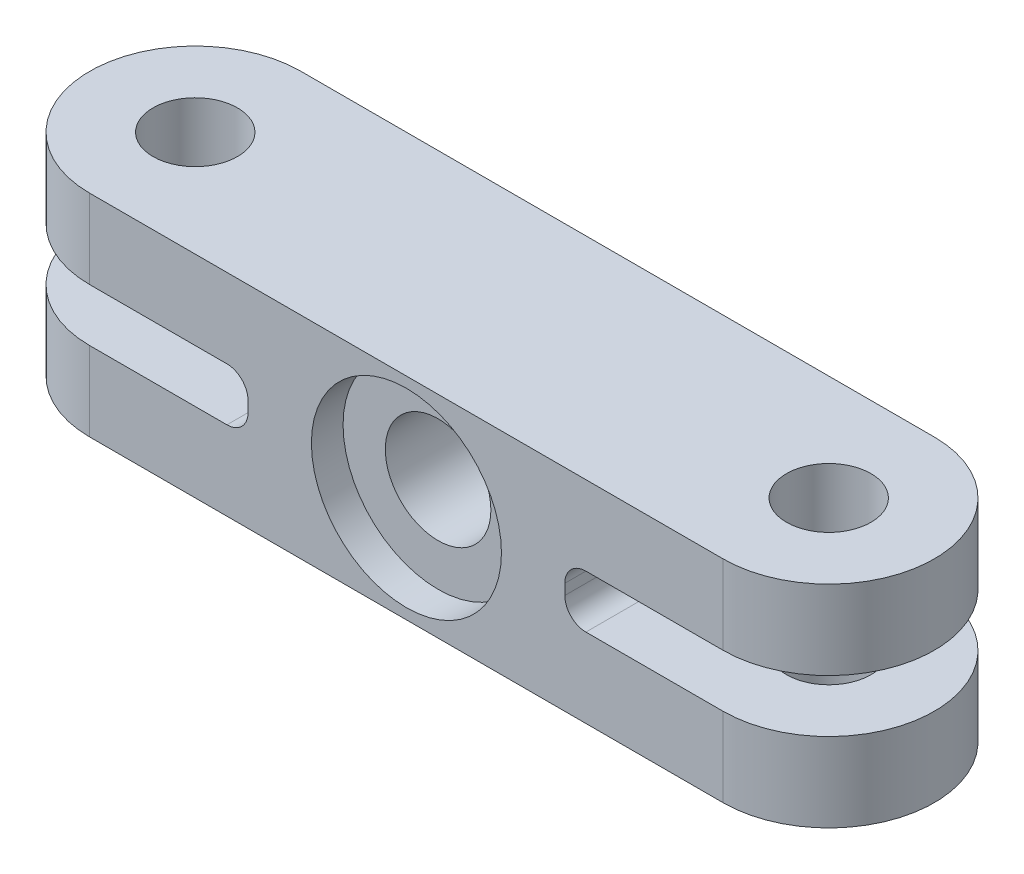
ISO-10303-21;
HEADER;
FILE_DESCRIPTION(('STEP AP214'),'2;1');
FILE_NAME('part.step','',(''),(''),'','','');
FILE_SCHEMA(('AUTOMOTIVE_DESIGN { 1 0 10303 214 1 1 1 1 }'));
ENDSEC;
DATA;
#1=APPLICATION_CONTEXT('core data for automotive mechanical design processes');
#2=APPLICATION_PROTOCOL_DEFINITION('international standard','automotive_design',2000,#1);
#3=PRODUCT_CONTEXT('',#1,'mechanical');
#4=PRODUCT('Part','Part','',(#3));
#5=PRODUCT_RELATED_PRODUCT_CATEGORY('part','',(#4));
#6=PRODUCT_DEFINITION_FORMATION('','',#4);
#7=PRODUCT_DEFINITION_CONTEXT('part definition',#1,'design');
#8=PRODUCT_DEFINITION('design','',#6,#7);
#9=PRODUCT_DEFINITION_SHAPE('','',#8);
#10=(LENGTH_UNIT() NAMED_UNIT(*) SI_UNIT(.MILLI.,.METRE.));
#11=(NAMED_UNIT(*) PLANE_ANGLE_UNIT() SI_UNIT($,.RADIAN.));
#12=(NAMED_UNIT(*) SI_UNIT($,.STERADIAN.) SOLID_ANGLE_UNIT());
#13=UNCERTAINTY_MEASURE_WITH_UNIT(LENGTH_MEASURE(1.E-05),#10,'distance_accuracy_value','');
#14=(GEOMETRIC_REPRESENTATION_CONTEXT(3) GLOBAL_UNCERTAINTY_ASSIGNED_CONTEXT((#13)) GLOBAL_UNIT_ASSIGNED_CONTEXT((#10,
#11,#12)) REPRESENTATION_CONTEXT('',''));
#15=CARTESIAN_POINT('',(0.,0.,0.));
#16=DIRECTION('',(0.,0.,1.));
#17=DIRECTION('',(1.,0.,0.));
#18=AXIS2_PLACEMENT_3D('',#15,#16,#17);
#19=CARTESIAN_POINT('',(0.,10.,-10.));
#20=DIRECTION('',(0.,0.,1.));
#21=DIRECTION('',(1.,0.,0.));
#22=AXIS2_PLACEMENT_3D('',#19,#20,#21);
#23=CYLINDRICAL_SURFACE('',#22,5.);
#24=CARTESIAN_POINT('',(0.,10.,-10.));
#25=DIRECTION('',(0.,0.,1.));
#26=DIRECTION('',(1.,0.,0.));
#27=AXIS2_PLACEMENT_3D('',#24,#25,#26);
#28=CIRCLE('',#27,5.);
#29=CARTESIAN_POINT('',(5.,10.,-10.));
#30=VERTEX_POINT('',#29);
#31=EDGE_CURVE('E215',#30,#30,#28,.T.);
#32=ORIENTED_EDGE('',*,*,#31,.F.);
#33=EDGE_LOOP('',(#32));
#34=FACE_BOUND('',#33,.T.);
#35=CARTESIAN_POINT('',(0.,10.,7.));
#36=DIRECTION('',(0.,0.,1.));
#37=DIRECTION('',(1.,0.,0.));
#38=AXIS2_PLACEMENT_3D('',#35,#36,#37);
#39=CIRCLE('',#38,5.);
#40=CARTESIAN_POINT('',(5.,10.,7.));
#41=VERTEX_POINT('',#40);
#42=EDGE_CURVE('E36',#41,#41,#39,.F.);
#43=ORIENTED_EDGE('',*,*,#42,.F.);
#44=EDGE_LOOP('',(#43));
#45=FACE_BOUND('',#44,.T.);
#46=ADVANCED_FACE('F32',(#34,#45),#23,.F.);
#47=CARTESIAN_POINT('',(30.,20.,0.));
#48=DIRECTION('',(0.,-1.,0.));
#49=DIRECTION('',(0.,0.,-1.));
#50=AXIS2_PLACEMENT_3D('',#47,#48,#49);
#51=CYLINDRICAL_SURFACE('',#50,10.);
#52=DIRECTION('',(0.,-1.,0.));
#53=VECTOR('',#52,1.);
#54=CARTESIAN_POINT('',(30.,20.,10.));
#55=LINE('',#54,#53);
#56=CARTESIAN_POINT('',(30.,20.,10.));
#57=VERTEX_POINT('',#56);
#58=CARTESIAN_POINT('',(30.,12.5,10.));
#59=VERTEX_POINT('',#58);
#60=EDGE_CURVE('E276',#57,#59,#55,.T.);
#61=ORIENTED_EDGE('',*,*,#60,.T.);
#62=CARTESIAN_POINT('',(30.,12.5,0.));
#63=DIRECTION('',(0.,1.,0.));
#64=DIRECTION('',(0.,0.,1.));
#65=AXIS2_PLACEMENT_3D('',#62,#63,#64);
#66=CIRCLE('',#65,10.);
#67=CARTESIAN_POINT('',(30.,12.5,-10.));
#68=VERTEX_POINT('',#67);
#69=EDGE_CURVE('E57',#59,#68,#66,.T.);
#70=ORIENTED_EDGE('',*,*,#69,.T.);
#71=DIRECTION('',(0.,-1.,0.));
#72=VECTOR('',#71,1.);
#73=CARTESIAN_POINT('',(30.,20.,-10.));
#74=LINE('',#73,#72);
#75=CARTESIAN_POINT('',(30.,20.,-10.));
#76=VERTEX_POINT('',#75);
#77=EDGE_CURVE('E11',#76,#68,#74,.T.);
#78=ORIENTED_EDGE('',*,*,#77,.F.);
#79=CARTESIAN_POINT('',(30.,20.,0.));
#80=DIRECTION('',(0.,1.,0.));
#81=DIRECTION('',(0.,0.,-1.));
#82=AXIS2_PLACEMENT_3D('',#79,#80,#81);
#83=CIRCLE('',#82,10.);
#84=EDGE_CURVE('E255',#57,#76,#83,.T.);
#85=ORIENTED_EDGE('',*,*,#84,.F.);
#86=EDGE_LOOP('',(#61,#70,#78,#85));
#87=FACE_BOUND('',#86,.T.);
#88=ADVANCED_FACE('F333',(#87),#51,.T.);
#89=CARTESIAN_POINT('',(-30.,20.,0.));
#90=DIRECTION('',(0.,-1.,0.));
#91=DIRECTION('',(0.,0.,-1.));
#92=AXIS2_PLACEMENT_3D('',#89,#90,#91);
#93=CYLINDRICAL_SURFACE('',#92,10.);
#94=DIRECTION('',(0.,-1.,0.));
#95=VECTOR('',#94,1.);
#96=CARTESIAN_POINT('',(-30.,20.,-10.));
#97=LINE('',#96,#95);
#98=CARTESIAN_POINT('',(-30.,20.,-10.));
#99=VERTEX_POINT('',#98);
#100=CARTESIAN_POINT('',(-30.,12.5,-10.));
#101=VERTEX_POINT('',#100);
#102=EDGE_CURVE('E284',#99,#101,#97,.T.);
#103=ORIENTED_EDGE('',*,*,#102,.T.);
#104=CARTESIAN_POINT('',(-30.,12.5,0.));
#105=DIRECTION('',(0.,1.,0.));
#106=DIRECTION('',(0.,0.,1.));
#107=AXIS2_PLACEMENT_3D('',#104,#105,#106);
#108=CIRCLE('',#107,10.);
#109=CARTESIAN_POINT('',(-30.,12.5,10.));
#110=VERTEX_POINT('',#109);
#111=EDGE_CURVE('E240',#101,#110,#108,.T.);
#112=ORIENTED_EDGE('',*,*,#111,.T.);
#113=DIRECTION('',(0.,-1.,0.));
#114=VECTOR('',#113,1.);
#115=CARTESIAN_POINT('',(-30.,20.,10.));
#116=LINE('',#115,#114);
#117=CARTESIAN_POINT('',(-30.,20.,10.));
#118=VERTEX_POINT('',#117);
#119=EDGE_CURVE('E280',#118,#110,#116,.T.);
#120=ORIENTED_EDGE('',*,*,#119,.F.);
#121=CARTESIAN_POINT('',(-30.,20.,0.));
#122=DIRECTION('',(0.,1.,0.));
#123=DIRECTION('',(0.,0.,1.));
#124=AXIS2_PLACEMENT_3D('',#121,#122,#123);
#125=CIRCLE('',#124,10.);
#126=EDGE_CURVE('E261',#99,#118,#125,.T.);
#127=ORIENTED_EDGE('',*,*,#126,.F.);
#128=EDGE_LOOP('',(#103,#112,#120,#127));
#129=FACE_BOUND('',#128,.T.);
#130=ADVANCED_FACE('F302',(#129),#93,.T.);
#131=CARTESIAN_POINT('',(-30.,20.,0.));
#132=DIRECTION('',(0.,-1.,0.));
#133=DIRECTION('',(0.,0.,-1.));
#134=AXIS2_PLACEMENT_3D('',#131,#132,#133);
#135=CYLINDRICAL_SURFACE('',#134,4.);
#136=CARTESIAN_POINT('',(-30.,12.5,0.));
#137=DIRECTION('',(0.,1.,0.));
#138=DIRECTION('',(0.,0.,1.));
#139=AXIS2_PLACEMENT_3D('',#136,#137,#138);
#140=CIRCLE('',#139,4.);
#141=CARTESIAN_POINT('',(-30.,12.5,4.));
#142=VERTEX_POINT('',#141);
#143=EDGE_CURVE('E239',#142,#142,#140,.T.);
#144=ORIENTED_EDGE('',*,*,#143,.F.);
#145=EDGE_LOOP('',(#144));
#146=FACE_BOUND('',#145,.T.);
#147=CARTESIAN_POINT('',(-30.,20.,0.));
#148=DIRECTION('',(0.,1.,0.));
#149=DIRECTION('',(0.,0.,1.));
#150=AXIS2_PLACEMENT_3D('',#147,#148,#149);
#151=CIRCLE('',#150,4.);
#152=CARTESIAN_POINT('',(-30.,20.,4.));
#153=VERTEX_POINT('',#152);
#154=EDGE_CURVE('E249',#153,#153,#151,.T.);
#155=ORIENTED_EDGE('',*,*,#154,.T.);
#156=EDGE_LOOP('',(#155));
#157=FACE_BOUND('',#156,.T.);
#158=ADVANCED_FACE('F298',(#146,#157),#135,.F.);
#159=CARTESIAN_POINT('',(30.,20.,0.));
#160=DIRECTION('',(0.,-1.,0.));
#161=DIRECTION('',(0.,0.,-1.));
#162=AXIS2_PLACEMENT_3D('',#159,#160,#161);
#163=CYLINDRICAL_SURFACE('',#162,4.);
#164=CARTESIAN_POINT('',(30.,7.5,0.));
#165=DIRECTION('',(0.,-1.,0.));
#166=DIRECTION('',(0.,0.,-1.));
#167=AXIS2_PLACEMENT_3D('',#164,#165,#166);
#168=CIRCLE('',#167,4.);
#169=CARTESIAN_POINT('',(30.,7.5,-4.));
#170=VERTEX_POINT('',#169);
#171=EDGE_CURVE('E234',#170,#170,#168,.T.);
#172=ORIENTED_EDGE('',*,*,#171,.F.);
#173=EDGE_LOOP('',(#172));
#174=FACE_BOUND('',#173,.T.);
#175=CARTESIAN_POINT('',(30.,0.,0.));
#176=DIRECTION('',(0.,1.,0.));
#177=DIRECTION('',(0.,0.,1.));
#178=AXIS2_PLACEMENT_3D('',#175,#176,#177);
#179=CIRCLE('',#178,4.);
#180=CARTESIAN_POINT('',(30.,0.,4.));
#181=VERTEX_POINT('',#180);
#182=EDGE_CURVE('E242',#181,#181,#179,.T.);
#183=ORIENTED_EDGE('',*,*,#182,.F.);
#184=EDGE_LOOP('',(#183));
#185=FACE_BOUND('',#184,.T.);
#186=ADVANCED_FACE('F301',(#174,#185),#163,.F.);
#187=CARTESIAN_POINT('',(30.,20.,0.));
#188=DIRECTION('',(0.,-1.,0.));
#189=DIRECTION('',(0.,0.,-1.));
#190=AXIS2_PLACEMENT_3D('',#187,#188,#189);
#191=PLANE('',#190);
#192=ORIENTED_EDGE('',*,*,#84,.T.);
#193=DIRECTION('',(-1.,0.,0.));
#194=VECTOR('',#193,1.);
#195=CARTESIAN_POINT('',(-30.,20.,-10.));
#196=LINE('',#195,#194);
#197=EDGE_CURVE('E258',#76,#99,#196,.T.);
#198=ORIENTED_EDGE('',*,*,#197,.T.);
#199=ORIENTED_EDGE('',*,*,#126,.T.);
#200=DIRECTION('',(1.,0.,0.));
#201=VECTOR('',#200,1.);
#202=CARTESIAN_POINT('',(-30.,20.,10.));
#203=LINE('',#202,#201);
#204=EDGE_CURVE('E263',#118,#57,#203,.T.);
#205=ORIENTED_EDGE('',*,*,#204,.T.);
#206=EDGE_LOOP('',(#192,#198,#199,#205));
#207=FACE_BOUND('',#206,.T.);
#208=ORIENTED_EDGE('',*,*,#154,.F.);
#209=EDGE_LOOP('',(#208));
#210=FACE_BOUND('',#209,.T.);
#211=CARTESIAN_POINT('',(30.,20.,0.));
#212=DIRECTION('',(0.,1.,0.));
#213=DIRECTION('',(0.,0.,1.));
#214=AXIS2_PLACEMENT_3D('',#211,#212,#213);
#215=CIRCLE('',#214,4.);
#216=CARTESIAN_POINT('',(30.,20.,4.));
#217=VERTEX_POINT('',#216);
#218=EDGE_CURVE('E243',#217,#217,#215,.T.);
#219=ORIENTED_EDGE('',*,*,#218,.F.);
#220=EDGE_LOOP('',(#219));
#221=FACE_BOUND('',#220,.T.);
#222=ADVANCED_FACE('F307',(#207,#210,#221),#191,.F.);
#223=CARTESIAN_POINT('',(30.,0.,0.));
#224=DIRECTION('',(0.,-1.,0.));
#225=DIRECTION('',(0.,0.,-1.));
#226=AXIS2_PLACEMENT_3D('',#223,#224,#225);
#227=PLANE('',#226);
#228=CARTESIAN_POINT('',(-30.,0.,0.));
#229=DIRECTION('',(0.,1.,0.));
#230=DIRECTION('',(0.,0.,1.));
#231=AXIS2_PLACEMENT_3D('',#228,#229,#230);
#232=CIRCLE('',#231,4.);
#233=CARTESIAN_POINT('',(-30.,0.,4.));
#234=VERTEX_POINT('',#233);
#235=EDGE_CURVE('E246',#234,#234,#232,.T.);
#236=ORIENTED_EDGE('',*,*,#235,.T.);
#237=EDGE_LOOP('',(#236));
#238=FACE_BOUND('',#237,.T.);
#239=CARTESIAN_POINT('',(30.,0.,0.));
#240=DIRECTION('',(0.,1.,0.));
#241=DIRECTION('',(0.,0.,-1.));
#242=AXIS2_PLACEMENT_3D('',#239,#240,#241);
#243=CIRCLE('',#242,10.);
#244=CARTESIAN_POINT('',(30.,0.,10.));
#245=VERTEX_POINT('',#244);
#246=CARTESIAN_POINT('',(30.,0.,-10.));
#247=VERTEX_POINT('',#246);
#248=EDGE_CURVE('E252',#245,#247,#243,.T.);
#249=ORIENTED_EDGE('',*,*,#248,.F.);
#250=DIRECTION('',(1.,0.,0.));
#251=VECTOR('',#250,1.);
#252=CARTESIAN_POINT('',(-30.,0.,10.));
#253=LINE('',#252,#251);
#254=CARTESIAN_POINT('',(-30.,0.,10.));
#255=VERTEX_POINT('',#254);
#256=EDGE_CURVE('E259',#255,#245,#253,.T.);
#257=ORIENTED_EDGE('',*,*,#256,.F.);
#258=CARTESIAN_POINT('',(-30.,0.,0.));
#259=DIRECTION('',(0.,1.,0.));
#260=DIRECTION('',(0.,0.,1.));
#261=AXIS2_PLACEMENT_3D('',#258,#259,#260);
#262=CIRCLE('',#261,10.);
#263=CARTESIAN_POINT('',(-30.,0.,-10.));
#264=VERTEX_POINT('',#263);
#265=EDGE_CURVE('E271',#264,#255,#262,.T.);
#266=ORIENTED_EDGE('',*,*,#265,.F.);
#267=DIRECTION('',(-1.,0.,0.));
#268=VECTOR('',#267,1.);
#269=CARTESIAN_POINT('',(-30.,0.,-10.));
#270=LINE('',#269,#268);
#271=EDGE_CURVE('E268',#247,#264,#270,.T.);
#272=ORIENTED_EDGE('',*,*,#271,.F.);
#273=EDGE_LOOP('',(#249,#257,#266,#272));
#274=FACE_BOUND('',#273,.T.);
#275=ORIENTED_EDGE('',*,*,#182,.T.);
#276=EDGE_LOOP('',(#275));
#277=FACE_BOUND('',#276,.T.);
#278=ADVANCED_FACE('F310',(#238,#274,#277),#227,.T.);
#279=CARTESIAN_POINT('',(30.,7.5,-10.));
#280=VERTEX_POINT('',#279);
#281=EDGE_CURVE('E41',#280,#247,#74,.T.);
#282=ORIENTED_EDGE('',*,*,#281,.F.);
#283=CARTESIAN_POINT('',(30.,7.5,0.));
#284=DIRECTION('',(0.,-1.,0.));
#285=DIRECTION('',(0.,0.,-1.));
#286=AXIS2_PLACEMENT_3D('',#283,#284,#285);
#287=CIRCLE('',#286,10.);
#288=CARTESIAN_POINT('',(30.,7.5,10.));
#289=VERTEX_POINT('',#288);
#290=EDGE_CURVE('E235',#280,#289,#287,.T.);
#291=ORIENTED_EDGE('',*,*,#290,.T.);
#292=EDGE_CURVE('E265',#289,#245,#55,.T.);
#293=ORIENTED_EDGE('',*,*,#292,.T.);
#294=ORIENTED_EDGE('',*,*,#248,.T.);
#295=EDGE_LOOP('',(#282,#291,#293,#294));
#296=FACE_BOUND('',#295,.T.);
#297=ADVANCED_FACE('F34',(#296),#51,.T.);
#298=CARTESIAN_POINT('',(-30.,20.,-10.));
#299=DIRECTION('',(0.,0.,1.));
#300=DIRECTION('',(1.,0.,0.));
#301=AXIS2_PLACEMENT_3D('',#298,#299,#300);
#302=PLANE('',#301);
#303=ORIENTED_EDGE('',*,*,#31,.T.);
#304=EDGE_LOOP('',(#303));
#305=FACE_BOUND('',#304,.T.);
#306=CARTESIAN_POINT('',(17.,9.5,-10.));
#307=DIRECTION('',(0.,0.,1.));
#308=DIRECTION('',(-1.,0.,0.));
#309=AXIS2_PLACEMENT_3D('',#306,#307,#308);
#310=CIRCLE('',#309,2.);
#311=CARTESIAN_POINT('',(15.,9.50000000000001,-10.));
#312=VERTEX_POINT('',#311);
#313=CARTESIAN_POINT('',(17.,7.5,-10.));
#314=VERTEX_POINT('',#313);
#315=EDGE_CURVE('E155',#312,#314,#310,.T.);
#316=ORIENTED_EDGE('',*,*,#315,.T.);
#317=DIRECTION('',(1.,0.,0.));
#318=VECTOR('',#317,1.);
#319=CARTESIAN_POINT('',(17.,7.5,-10.));
#320=LINE('',#319,#318);
#321=EDGE_CURVE('E168',#314,#280,#320,.T.);
#322=ORIENTED_EDGE('',*,*,#321,.T.);
#323=ORIENTED_EDGE('',*,*,#281,.T.);
#324=ORIENTED_EDGE('',*,*,#271,.T.);
#325=CARTESIAN_POINT('',(-30.,7.5,-10.));
#326=VERTEX_POINT('',#325);
#327=EDGE_CURVE('E283',#326,#264,#97,.T.);
#328=ORIENTED_EDGE('',*,*,#327,.F.);
#329=DIRECTION('',(1.,0.,0.));
#330=VECTOR('',#329,1.);
#331=CARTESIAN_POINT('',(-17.,7.5,-10.));
#332=LINE('',#331,#330);
#333=CARTESIAN_POINT('',(-17.,7.5,-10.));
#334=VERTEX_POINT('',#333);
#335=EDGE_CURVE('E195',#326,#334,#332,.T.);
#336=ORIENTED_EDGE('',*,*,#335,.T.);
#337=CARTESIAN_POINT('',(-17.,9.5,-10.));
#338=DIRECTION('',(0.,0.,1.));
#339=DIRECTION('',(1.,0.,0.));
#340=AXIS2_PLACEMENT_3D('',#337,#338,#339);
#341=CIRCLE('',#340,2.);
#342=CARTESIAN_POINT('',(-15.,9.5,-10.));
#343=VERTEX_POINT('',#342);
#344=EDGE_CURVE('E198',#334,#343,#341,.T.);
#345=ORIENTED_EDGE('',*,*,#344,.T.);
#346=DIRECTION('',(0.,1.,0.));
#347=VECTOR('',#346,1.);
#348=CARTESIAN_POINT('',(-15.,10.5,-10.));
#349=LINE('',#348,#347);
#350=CARTESIAN_POINT('',(-15.,10.5,-10.));
#351=VERTEX_POINT('',#350);
#352=EDGE_CURVE('E202',#343,#351,#349,.T.);
#353=ORIENTED_EDGE('',*,*,#352,.T.);
#354=CARTESIAN_POINT('',(-17.,10.5,-10.));
#355=DIRECTION('',(0.,0.,1.));
#356=DIRECTION('',(1.,0.,0.));
#357=AXIS2_PLACEMENT_3D('',#354,#355,#356);
#358=CIRCLE('',#357,2.);
#359=CARTESIAN_POINT('',(-17.,12.5,-10.));
#360=VERTEX_POINT('',#359);
#361=EDGE_CURVE('E205',#351,#360,#358,.T.);
#362=ORIENTED_EDGE('',*,*,#361,.T.);
#363=DIRECTION('',(-1.,0.,0.));
#364=VECTOR('',#363,1.);
#365=CARTESIAN_POINT('',(-40.,12.5,-10.));
#366=LINE('',#365,#364);
#367=EDGE_CURVE('E208',#360,#101,#366,.T.);
#368=ORIENTED_EDGE('',*,*,#367,.T.);
#369=ORIENTED_EDGE('',*,*,#102,.F.);
#370=ORIENTED_EDGE('',*,*,#197,.F.);
#371=ORIENTED_EDGE('',*,*,#77,.T.);
#372=DIRECTION('',(-1.,0.,0.));
#373=VECTOR('',#372,1.);
#374=CARTESIAN_POINT('',(40.,12.5,-10.));
#375=LINE('',#374,#373);
#376=CARTESIAN_POINT('',(17.,12.5,-10.));
#377=VERTEX_POINT('',#376);
#378=EDGE_CURVE('E149',#68,#377,#375,.T.);
#379=ORIENTED_EDGE('',*,*,#378,.T.);
#380=CARTESIAN_POINT('',(17.,10.5,-10.));
#381=DIRECTION('',(0.,0.,1.));
#382=DIRECTION('',(-1.,0.,0.));
#383=AXIS2_PLACEMENT_3D('',#380,#381,#382);
#384=CIRCLE('',#383,2.);
#385=CARTESIAN_POINT('',(15.,10.5,-10.));
#386=VERTEX_POINT('',#385);
#387=EDGE_CURVE('E158',#377,#386,#384,.T.);
#388=ORIENTED_EDGE('',*,*,#387,.T.);
#389=DIRECTION('',(0.,-1.,0.));
#390=VECTOR('',#389,1.);
#391=CARTESIAN_POINT('',(15.,10.5,-10.));
#392=LINE('',#391,#390);
#393=EDGE_CURVE('E163',#386,#312,#392,.T.);
#394=ORIENTED_EDGE('',*,*,#393,.T.);
#395=EDGE_LOOP('',(#316,#322,#323,#324,#328,#336,#345,#353,#362,#368,#369,#370,#371,#379,#388,#394));
#396=FACE_BOUND('',#395,.T.);
#397=ADVANCED_FACE('F166',(#305,#396),#302,.F.);
#398=CARTESIAN_POINT('',(-30.,7.5,10.));
#399=VERTEX_POINT('',#398);
#400=EDGE_CURVE('E279',#399,#255,#116,.T.);
#401=ORIENTED_EDGE('',*,*,#400,.F.);
#402=CARTESIAN_POINT('',(-30.,7.5,0.));
#403=DIRECTION('',(0.,-1.,0.));
#404=DIRECTION('',(0.,0.,-1.));
#405=AXIS2_PLACEMENT_3D('',#402,#403,#404);
#406=CIRCLE('',#405,10.);
#407=EDGE_CURVE('E49',#399,#326,#406,.T.);
#408=ORIENTED_EDGE('',*,*,#407,.T.);
#409=ORIENTED_EDGE('',*,*,#327,.T.);
#410=ORIENTED_EDGE('',*,*,#265,.T.);
#411=EDGE_LOOP('',(#401,#408,#409,#410));
#412=FACE_BOUND('',#411,.T.);
#413=ADVANCED_FACE('F393',(#412),#93,.T.);
#414=CARTESIAN_POINT('',(-30.,20.,10.));
#415=DIRECTION('',(0.,0.,-1.));
#416=DIRECTION('',(-1.,0.,0.));
#417=AXIS2_PLACEMENT_3D('',#414,#415,#416);
#418=PLANE('',#417);
#419=CARTESIAN_POINT('',(0.,10.,10.));
#420=DIRECTION('',(0.,0.,1.));
#421=DIRECTION('',(1.,0.,0.));
#422=AXIS2_PLACEMENT_3D('',#419,#420,#421);
#423=CIRCLE('',#422,9.);
#424=CARTESIAN_POINT('',(9.,10.,10.));
#425=VERTEX_POINT('',#424);
#426=EDGE_CURVE('E433',#425,#425,#423,.T.);
#427=ORIENTED_EDGE('',*,*,#426,.F.);
#428=EDGE_LOOP('',(#427));
#429=FACE_BOUND('',#428,.T.);
#430=ORIENTED_EDGE('',*,*,#292,.F.);
#431=DIRECTION('',(1.,0.,0.));
#432=VECTOR('',#431,1.);
#433=CARTESIAN_POINT('',(17.,7.5,10.));
#434=LINE('',#433,#432);
#435=CARTESIAN_POINT('',(17.,7.5,10.));
#436=VERTEX_POINT('',#435);
#437=EDGE_CURVE('E177',#436,#289,#434,.T.);
#438=ORIENTED_EDGE('',*,*,#437,.F.);
#439=CARTESIAN_POINT('',(17.,9.5,10.));
#440=DIRECTION('',(0.,0.,1.));
#441=DIRECTION('',(-1.,0.,0.));
#442=AXIS2_PLACEMENT_3D('',#439,#440,#441);
#443=CIRCLE('',#442,2.);
#444=CARTESIAN_POINT('',(15.,9.50000000000001,10.));
#445=VERTEX_POINT('',#444);
#446=EDGE_CURVE('E171',#445,#436,#443,.T.);
#447=ORIENTED_EDGE('',*,*,#446,.F.);
#448=DIRECTION('',(0.,-1.,0.));
#449=VECTOR('',#448,1.);
#450=CARTESIAN_POINT('',(15.,10.5,10.));
#451=LINE('',#450,#449);
#452=CARTESIAN_POINT('',(15.,10.5,10.));
#453=VERTEX_POINT('',#452);
#454=EDGE_CURVE('E184',#453,#445,#451,.T.);
#455=ORIENTED_EDGE('',*,*,#454,.F.);
#456=CARTESIAN_POINT('',(17.,10.5,10.));
#457=DIRECTION('',(0.,0.,1.));
#458=DIRECTION('',(-1.,0.,0.));
#459=AXIS2_PLACEMENT_3D('',#456,#457,#458);
#460=CIRCLE('',#459,2.);
#461=CARTESIAN_POINT('',(17.,12.5,10.));
#462=VERTEX_POINT('',#461);
#463=EDGE_CURVE('E182',#462,#453,#460,.T.);
#464=ORIENTED_EDGE('',*,*,#463,.F.);
#465=DIRECTION('',(-1.,0.,0.));
#466=VECTOR('',#465,1.);
#467=CARTESIAN_POINT('',(40.,12.5,10.));
#468=LINE('',#467,#466);
#469=EDGE_CURVE('E150',#59,#462,#468,.T.);
#470=ORIENTED_EDGE('',*,*,#469,.F.);
#471=ORIENTED_EDGE('',*,*,#60,.F.);
#472=ORIENTED_EDGE('',*,*,#204,.F.);
#473=ORIENTED_EDGE('',*,*,#119,.T.);
#474=DIRECTION('',(-1.,0.,0.));
#475=VECTOR('',#474,1.);
#476=CARTESIAN_POINT('',(-40.,12.5,10.));
#477=LINE('',#476,#475);
#478=CARTESIAN_POINT('',(-17.,12.5,10.));
#479=VERTEX_POINT('',#478);
#480=EDGE_CURVE('E199',#479,#110,#477,.T.);
#481=ORIENTED_EDGE('',*,*,#480,.F.);
#482=CARTESIAN_POINT('',(-17.,10.5,10.));
#483=DIRECTION('',(0.,0.,1.));
#484=DIRECTION('',(1.,0.,0.));
#485=AXIS2_PLACEMENT_3D('',#482,#483,#484);
#486=CIRCLE('',#485,2.);
#487=CARTESIAN_POINT('',(-15.,10.5,10.));
#488=VERTEX_POINT('',#487);
#489=EDGE_CURVE('E221',#488,#479,#486,.T.);
#490=ORIENTED_EDGE('',*,*,#489,.F.);
#491=DIRECTION('',(0.,1.,0.));
#492=VECTOR('',#491,1.);
#493=CARTESIAN_POINT('',(-15.,10.5,10.));
#494=LINE('',#493,#492);
#495=CARTESIAN_POINT('',(-15.,9.5,10.));
#496=VERTEX_POINT('',#495);
#497=EDGE_CURVE('E218',#496,#488,#494,.T.);
#498=ORIENTED_EDGE('',*,*,#497,.F.);
#499=CARTESIAN_POINT('',(-17.,9.5,10.));
#500=DIRECTION('',(0.,0.,1.));
#501=DIRECTION('',(1.,0.,0.));
#502=AXIS2_PLACEMENT_3D('',#499,#500,#501);
#503=CIRCLE('',#502,2.);
#504=CARTESIAN_POINT('',(-17.,7.5,10.));
#505=VERTEX_POINT('',#504);
#506=EDGE_CURVE('E214',#505,#496,#503,.T.);
#507=ORIENTED_EDGE('',*,*,#506,.F.);
#508=DIRECTION('',(1.,0.,0.));
#509=VECTOR('',#508,1.);
#510=CARTESIAN_POINT('',(-17.,7.5,10.));
#511=LINE('',#510,#509);
#512=EDGE_CURVE('E212',#399,#505,#511,.T.);
#513=ORIENTED_EDGE('',*,*,#512,.F.);
#514=ORIENTED_EDGE('',*,*,#400,.T.);
#515=ORIENTED_EDGE('',*,*,#256,.T.);
#516=EDGE_LOOP('',(#430,#438,#447,#455,#464,#470,#471,#472,#473,#481,#490,#498,#507,#513,#514,#515));
#517=FACE_BOUND('',#516,.T.);
#518=ADVANCED_FACE('F326',(#429,#517),#418,.F.);
#519=CARTESIAN_POINT('',(-30.,7.5,0.));
#520=DIRECTION('',(0.,-1.,0.));
#521=DIRECTION('',(0.,0.,-1.));
#522=AXIS2_PLACEMENT_3D('',#519,#520,#521);
#523=CIRCLE('',#522,4.);
#524=CARTESIAN_POINT('',(-30.,7.5,-4.));
#525=VERTEX_POINT('',#524);
#526=EDGE_CURVE('E237',#525,#525,#523,.T.);
#527=ORIENTED_EDGE('',*,*,#526,.F.);
#528=EDGE_LOOP('',(#527));
#529=FACE_BOUND('',#528,.T.);
#530=ORIENTED_EDGE('',*,*,#235,.F.);
#531=EDGE_LOOP('',(#530));
#532=FACE_BOUND('',#531,.T.);
#533=ADVANCED_FACE('F304',(#529,#532),#135,.F.);
#534=CARTESIAN_POINT('',(30.,12.5,0.));
#535=DIRECTION('',(0.,1.,0.));
#536=DIRECTION('',(0.,0.,1.));
#537=AXIS2_PLACEMENT_3D('',#534,#535,#536);
#538=CIRCLE('',#537,4.);
#539=CARTESIAN_POINT('',(30.,12.5,4.));
#540=VERTEX_POINT('',#539);
#541=EDGE_CURVE('E191',#540,#540,#538,.T.);
#542=ORIENTED_EDGE('',*,*,#541,.F.);
#543=EDGE_LOOP('',(#542));
#544=FACE_BOUND('',#543,.T.);
#545=ORIENTED_EDGE('',*,*,#218,.T.);
#546=EDGE_LOOP('',(#545));
#547=FACE_BOUND('',#546,.T.);
#548=ADVANCED_FACE('F315',(#544,#547),#163,.F.);
#549=CARTESIAN_POINT('',(17.,7.5,-10.));
#550=DIRECTION('',(0.,-1.,0.));
#551=DIRECTION('',(0.,0.,-1.));
#552=AXIS2_PLACEMENT_3D('',#549,#550,#551);
#553=PLANE('',#552);
#554=ORIENTED_EDGE('',*,*,#171,.T.);
#555=EDGE_LOOP('',(#554));
#556=FACE_BOUND('',#555,.T.);
#557=ORIENTED_EDGE('',*,*,#321,.F.);
#558=DIRECTION('',(0.,0.,1.));
#559=VECTOR('',#558,1.);
#560=CARTESIAN_POINT('',(17.,7.5,-10.));
#561=LINE('',#560,#559);
#562=EDGE_CURVE('E189',#314,#436,#561,.T.);
#563=ORIENTED_EDGE('',*,*,#562,.T.);
#564=ORIENTED_EDGE('',*,*,#437,.T.);
#565=ORIENTED_EDGE('',*,*,#290,.F.);
#566=EDGE_LOOP('',(#557,#563,#564,#565));
#567=FACE_BOUND('',#566,.T.);
#568=ADVANCED_FACE('F317',(#556,#567),#553,.F.);
#569=CARTESIAN_POINT('',(40.,12.5,-10.));
#570=DIRECTION('',(0.,1.,0.));
#571=DIRECTION('',(0.,0.,1.));
#572=AXIS2_PLACEMENT_3D('',#569,#570,#571);
#573=PLANE('',#572);
#574=ORIENTED_EDGE('',*,*,#541,.T.);
#575=EDGE_LOOP('',(#574));
#576=FACE_BOUND('',#575,.T.);
#577=ORIENTED_EDGE('',*,*,#469,.T.);
#578=DIRECTION('',(0.,0.,1.));
#579=VECTOR('',#578,1.);
#580=CARTESIAN_POINT('',(17.,12.5,-10.));
#581=LINE('',#580,#579);
#582=EDGE_CURVE('E145',#377,#462,#581,.T.);
#583=ORIENTED_EDGE('',*,*,#582,.F.);
#584=ORIENTED_EDGE('',*,*,#378,.F.);
#585=ORIENTED_EDGE('',*,*,#69,.F.);
#586=EDGE_LOOP('',(#577,#583,#584,#585));
#587=FACE_BOUND('',#586,.T.);
#588=ADVANCED_FACE('F147',(#576,#587),#573,.F.);
#589=CARTESIAN_POINT('',(17.,9.5,-10.));
#590=DIRECTION('',(0.,0.,1.));
#591=DIRECTION('',(1.,0.,0.));
#592=AXIS2_PLACEMENT_3D('',#589,#590,#591);
#593=CYLINDRICAL_SURFACE('',#592,2.);
#594=ORIENTED_EDGE('',*,*,#446,.T.);
#595=ORIENTED_EDGE('',*,*,#562,.F.);
#596=ORIENTED_EDGE('',*,*,#315,.F.);
#597=DIRECTION('',(0.,0.,1.));
#598=VECTOR('',#597,1.);
#599=CARTESIAN_POINT('',(15.,9.50000000000001,-10.));
#600=LINE('',#599,#598);
#601=EDGE_CURVE('E192',#312,#445,#600,.T.);
#602=ORIENTED_EDGE('',*,*,#601,.T.);
#603=EDGE_LOOP('',(#594,#595,#596,#602));
#604=FACE_BOUND('',#603,.T.);
#605=ADVANCED_FACE('F346',(#604),#593,.F.);
#606=CARTESIAN_POINT('',(15.,10.5,-10.));
#607=DIRECTION('',(-1.,0.,0.));
#608=DIRECTION('',(0.,0.,1.));
#609=AXIS2_PLACEMENT_3D('',#606,#607,#608);
#610=PLANE('',#609);
#611=ORIENTED_EDGE('',*,*,#454,.T.);
#612=ORIENTED_EDGE('',*,*,#601,.F.);
#613=ORIENTED_EDGE('',*,*,#393,.F.);
#614=DIRECTION('',(0.,0.,1.));
#615=VECTOR('',#614,1.);
#616=CARTESIAN_POINT('',(15.,10.5,-10.));
#617=LINE('',#616,#615);
#618=EDGE_CURVE('E154',#386,#453,#617,.T.);
#619=ORIENTED_EDGE('',*,*,#618,.T.);
#620=EDGE_LOOP('',(#611,#612,#613,#619));
#621=FACE_BOUND('',#620,.T.);
#622=ADVANCED_FACE('F349',(#621),#610,.F.);
#623=CARTESIAN_POINT('',(17.,10.5,-10.));
#624=DIRECTION('',(0.,0.,1.));
#625=DIRECTION('',(1.,0.,0.));
#626=AXIS2_PLACEMENT_3D('',#623,#624,#625);
#627=CYLINDRICAL_SURFACE('',#626,2.);
#628=ORIENTED_EDGE('',*,*,#463,.T.);
#629=ORIENTED_EDGE('',*,*,#618,.F.);
#630=ORIENTED_EDGE('',*,*,#387,.F.);
#631=ORIENTED_EDGE('',*,*,#582,.T.);
#632=EDGE_LOOP('',(#628,#629,#630,#631));
#633=FACE_BOUND('',#632,.T.);
#634=ADVANCED_FACE('F159',(#633),#627,.F.);
#635=CARTESIAN_POINT('',(-40.,12.5,-10.));
#636=DIRECTION('',(0.,1.,0.));
#637=DIRECTION('',(0.,0.,1.));
#638=AXIS2_PLACEMENT_3D('',#635,#636,#637);
#639=PLANE('',#638);
#640=ORIENTED_EDGE('',*,*,#143,.T.);
#641=EDGE_LOOP('',(#640));
#642=FACE_BOUND('',#641,.T.);
#643=ORIENTED_EDGE('',*,*,#367,.F.);
#644=DIRECTION('',(0.,0.,1.));
#645=VECTOR('',#644,1.);
#646=CARTESIAN_POINT('',(-17.,12.5,-10.));
#647=LINE('',#646,#645);
#648=EDGE_CURVE('E180',#360,#479,#647,.T.);
#649=ORIENTED_EDGE('',*,*,#648,.T.);
#650=ORIENTED_EDGE('',*,*,#480,.T.);
#651=ORIENTED_EDGE('',*,*,#111,.F.);
#652=EDGE_LOOP('',(#643,#649,#650,#651));
#653=FACE_BOUND('',#652,.T.);
#654=ADVANCED_FACE('F295',(#642,#653),#639,.F.);
#655=CARTESIAN_POINT('',(-17.,7.5,-10.));
#656=DIRECTION('',(0.,-1.,0.));
#657=DIRECTION('',(0.,0.,-1.));
#658=AXIS2_PLACEMENT_3D('',#655,#656,#657);
#659=PLANE('',#658);
#660=ORIENTED_EDGE('',*,*,#526,.T.);
#661=EDGE_LOOP('',(#660));
#662=FACE_BOUND('',#661,.T.);
#663=ORIENTED_EDGE('',*,*,#512,.T.);
#664=DIRECTION('',(0.,0.,1.));
#665=VECTOR('',#664,1.);
#666=CARTESIAN_POINT('',(-17.,7.5,-10.));
#667=LINE('',#666,#665);
#668=EDGE_CURVE('E211',#334,#505,#667,.T.);
#669=ORIENTED_EDGE('',*,*,#668,.F.);
#670=ORIENTED_EDGE('',*,*,#335,.F.);
#671=ORIENTED_EDGE('',*,*,#407,.F.);
#672=EDGE_LOOP('',(#663,#669,#670,#671));
#673=FACE_BOUND('',#672,.T.);
#674=ADVANCED_FACE('F361',(#662,#673),#659,.F.);
#675=CARTESIAN_POINT('',(-17.,10.5,-10.));
#676=DIRECTION('',(0.,0.,1.));
#677=DIRECTION('',(1.,0.,0.));
#678=AXIS2_PLACEMENT_3D('',#675,#676,#677);
#679=CYLINDRICAL_SURFACE('',#678,2.);
#680=ORIENTED_EDGE('',*,*,#489,.T.);
#681=ORIENTED_EDGE('',*,*,#648,.F.);
#682=ORIENTED_EDGE('',*,*,#361,.F.);
#683=DIRECTION('',(0.,0.,1.));
#684=VECTOR('',#683,1.);
#685=CARTESIAN_POINT('',(-15.,10.5,-10.));
#686=LINE('',#685,#684);
#687=EDGE_CURVE('E227',#351,#488,#686,.T.);
#688=ORIENTED_EDGE('',*,*,#687,.T.);
#689=EDGE_LOOP('',(#680,#681,#682,#688));
#690=FACE_BOUND('',#689,.T.);
#691=ADVANCED_FACE('F362',(#690),#679,.F.);
#692=CARTESIAN_POINT('',(-15.,10.5,-10.));
#693=DIRECTION('',(1.,0.,0.));
#694=DIRECTION('',(0.,0.,-1.));
#695=AXIS2_PLACEMENT_3D('',#692,#693,#694);
#696=PLANE('',#695);
#697=ORIENTED_EDGE('',*,*,#497,.T.);
#698=ORIENTED_EDGE('',*,*,#687,.F.);
#699=ORIENTED_EDGE('',*,*,#352,.F.);
#700=DIRECTION('',(0.,0.,1.));
#701=VECTOR('',#700,1.);
#702=CARTESIAN_POINT('',(-15.,9.5,-10.));
#703=LINE('',#702,#701);
#704=EDGE_CURVE('E229',#343,#496,#703,.T.);
#705=ORIENTED_EDGE('',*,*,#704,.T.);
#706=EDGE_LOOP('',(#697,#698,#699,#705));
#707=FACE_BOUND('',#706,.T.);
#708=ADVANCED_FACE('F365',(#707),#696,.F.);
#709=CARTESIAN_POINT('',(-17.,9.5,-10.));
#710=DIRECTION('',(0.,0.,1.));
#711=DIRECTION('',(1.,0.,0.));
#712=AXIS2_PLACEMENT_3D('',#709,#710,#711);
#713=CYLINDRICAL_SURFACE('',#712,2.);
#714=ORIENTED_EDGE('',*,*,#506,.T.);
#715=ORIENTED_EDGE('',*,*,#704,.F.);
#716=ORIENTED_EDGE('',*,*,#344,.F.);
#717=ORIENTED_EDGE('',*,*,#668,.T.);
#718=EDGE_LOOP('',(#714,#715,#716,#717));
#719=FACE_BOUND('',#718,.T.);
#720=ADVANCED_FACE('F369',(#719),#713,.F.);
#721=CARTESIAN_POINT('',(0.,10.,7.));
#722=DIRECTION('',(0.,0.,1.));
#723=DIRECTION('',(1.,0.,0.));
#724=AXIS2_PLACEMENT_3D('',#721,#722,#723);
#725=PLANE('',#724);
#726=CARTESIAN_POINT('',(0.,10.,7.));
#727=DIRECTION('',(0.,0.,1.));
#728=DIRECTION('',(1.,0.,0.));
#729=AXIS2_PLACEMENT_3D('',#726,#727,#728);
#730=CIRCLE('',#729,9.);
#731=CARTESIAN_POINT('',(9.,10.,7.));
#732=VERTEX_POINT('',#731);
#733=EDGE_CURVE('E431',#732,#732,#730,.T.);
#734=ORIENTED_EDGE('',*,*,#733,.T.);
#735=EDGE_LOOP('',(#734));
#736=FACE_BOUND('',#735,.T.);
#737=ORIENTED_EDGE('',*,*,#42,.T.);
#738=EDGE_LOOP('',(#737));
#739=FACE_BOUND('',#738,.T.);
#740=ADVANCED_FACE('F372',(#736,#739),#725,.T.);
#741=CARTESIAN_POINT('',(0.,10.,7.));
#742=DIRECTION('',(0.,0.,1.));
#743=DIRECTION('',(1.,0.,0.));
#744=AXIS2_PLACEMENT_3D('',#741,#742,#743);
#745=CYLINDRICAL_SURFACE('',#744,9.);
#746=ORIENTED_EDGE('',*,*,#733,.F.);
#747=EDGE_LOOP('',(#746));
#748=FACE_BOUND('',#747,.T.);
#749=ORIENTED_EDGE('',*,*,#426,.T.);
#750=EDGE_LOOP('',(#749));
#751=FACE_BOUND('',#750,.T.);
#752=ADVANCED_FACE('F344',(#748,#751),#745,.F.);
#753=CLOSED_SHELL('',(#46,#88,#130,#158,#186,#222,#278,#297,#397,#413,#518,#533,#548,#568,#588,
#605,#622,#634,#654,#674,#691,#708,#720,#740,#752));
#754=MANIFOLD_SOLID_BREP('B2',#753);
#755=ADVANCED_BREP_SHAPE_REPRESENTATION('',(#18,#754),#14);
#756=SHAPE_DEFINITION_REPRESENTATION(#9,#755);
ENDSEC;
END-ISO-10303-21;
